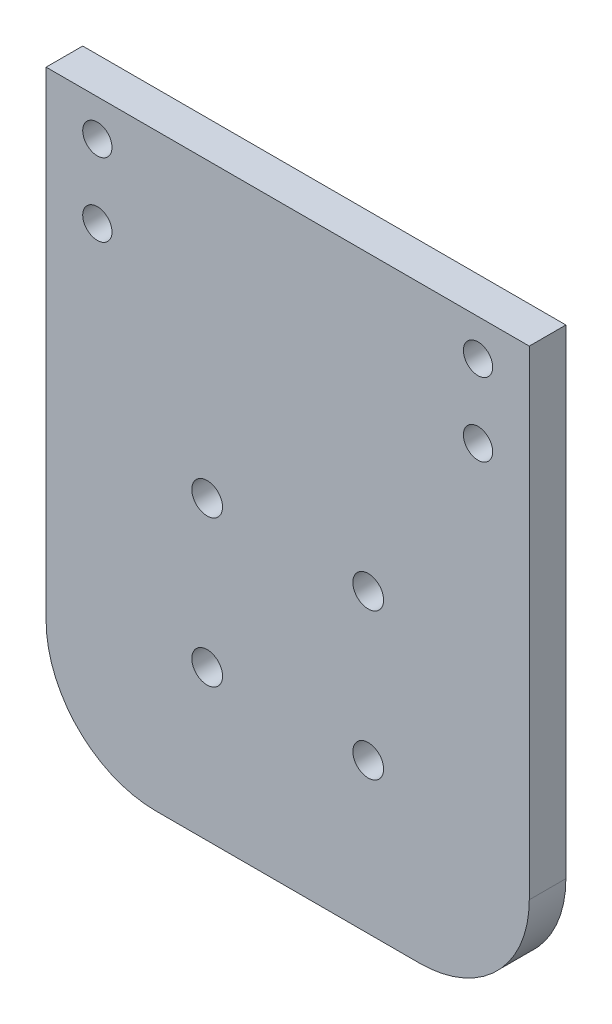
ISO-10303-21;
HEADER;
FILE_DESCRIPTION(('STEP AP214'),'2;1');
FILE_NAME('part.step','',(''),(''),'','','');
FILE_SCHEMA(('AUTOMOTIVE_DESIGN { 1 0 10303 214 1 1 1 1 }'));
ENDSEC;
DATA;
#1=APPLICATION_CONTEXT('core data for automotive mechanical design processes');
#2=APPLICATION_PROTOCOL_DEFINITION('international standard','automotive_design',2000,#1);
#3=PRODUCT_CONTEXT('',#1,'mechanical');
#4=PRODUCT('Part','Part','',(#3));
#5=PRODUCT_RELATED_PRODUCT_CATEGORY('part','',(#4));
#6=PRODUCT_DEFINITION_FORMATION('','',#4);
#7=PRODUCT_DEFINITION_CONTEXT('part definition',#1,'design');
#8=PRODUCT_DEFINITION('design','',#6,#7);
#9=PRODUCT_DEFINITION_SHAPE('','',#8);
#10=(LENGTH_UNIT() NAMED_UNIT(*) SI_UNIT(.MILLI.,.METRE.));
#11=(NAMED_UNIT(*) PLANE_ANGLE_UNIT() SI_UNIT($,.RADIAN.));
#12=(NAMED_UNIT(*) SI_UNIT($,.STERADIAN.) SOLID_ANGLE_UNIT());
#13=UNCERTAINTY_MEASURE_WITH_UNIT(LENGTH_MEASURE(1.E-05),#10,'distance_accuracy_value','');
#14=(GEOMETRIC_REPRESENTATION_CONTEXT(3) GLOBAL_UNCERTAINTY_ASSIGNED_CONTEXT((#13)) GLOBAL_UNIT_ASSIGNED_CONTEXT((#10,
#11,#12)) REPRESENTATION_CONTEXT('',''));
#15=CARTESIAN_POINT('',(0.,0.,0.));
#16=DIRECTION('',(0.,0.,1.));
#17=DIRECTION('',(1.,0.,0.));
#18=AXIS2_PLACEMENT_3D('',#15,#16,#17);
#19=CARTESIAN_POINT('',(-33.,-40.25,5.));
#20=DIRECTION('',(1.,0.,0.));
#21=DIRECTION('',(0.,1.,0.));
#22=AXIS2_PLACEMENT_3D('',#19,#20,#21);
#23=PLANE('',#22);
#24=DIRECTION('',(0.,-1.,0.));
#25=VECTOR('',#24,1.);
#26=CARTESIAN_POINT('',(-33.,-40.25,0.));
#27=LINE('',#26,#25);
#28=CARTESIAN_POINT('',(-33.,40.25,0.));
#29=VERTEX_POINT('',#28);
#30=CARTESIAN_POINT('',(-33.,-25.25,0.));
#31=VERTEX_POINT('',#30);
#32=EDGE_CURVE('E123',#29,#31,#27,.T.);
#33=ORIENTED_EDGE('',*,*,#32,.T.);
#34=DIRECTION('',(0.,0.,-1.));
#35=VECTOR('',#34,1.);
#36=CARTESIAN_POINT('',(-33.,-25.25,5.));
#37=LINE('',#36,#35);
#38=CARTESIAN_POINT('',(-33.,-25.25,5.));
#39=VERTEX_POINT('',#38);
#40=EDGE_CURVE('E63',#31,#39,#37,.F.);
#41=ORIENTED_EDGE('',*,*,#40,.T.);
#42=DIRECTION('',(0.,-1.,0.));
#43=VECTOR('',#42,1.);
#44=CARTESIAN_POINT('',(-33.,-40.25,5.));
#45=LINE('',#44,#43);
#46=CARTESIAN_POINT('',(-33.,40.25,5.));
#47=VERTEX_POINT('',#46);
#48=EDGE_CURVE('E135',#47,#39,#45,.T.);
#49=ORIENTED_EDGE('',*,*,#48,.F.);
#50=DIRECTION('',(0.,0.,-1.));
#51=VECTOR('',#50,1.);
#52=CARTESIAN_POINT('',(-33.,40.25,5.));
#53=LINE('',#52,#51);
#54=EDGE_CURVE('E113',#47,#29,#53,.T.);
#55=ORIENTED_EDGE('',*,*,#54,.T.);
#56=EDGE_LOOP('',(#33,#41,#49,#55));
#57=FACE_BOUND('',#56,.T.);
#58=ADVANCED_FACE('F39',(#57),#23,.F.);
#59=CARTESIAN_POINT('',(33.,-40.25,5.));
#60=DIRECTION('',(0.,1.,0.));
#61=DIRECTION('',(-1.,0.,0.));
#62=AXIS2_PLACEMENT_3D('',#59,#60,#61);
#63=PLANE('',#62);
#64=DIRECTION('',(1.,0.,0.));
#65=VECTOR('',#64,1.);
#66=CARTESIAN_POINT('',(33.,-40.25,5.));
#67=LINE('',#66,#65);
#68=CARTESIAN_POINT('',(-18.,-40.25,5.));
#69=VERTEX_POINT('',#68);
#70=CARTESIAN_POINT('',(18.,-40.25,5.));
#71=VERTEX_POINT('',#70);
#72=EDGE_CURVE('E102',#69,#71,#67,.T.);
#73=ORIENTED_EDGE('',*,*,#72,.F.);
#74=DIRECTION('',(0.,0.,-1.));
#75=VECTOR('',#74,1.);
#76=CARTESIAN_POINT('',(-18.,-40.25,5.));
#77=LINE('',#76,#75);
#78=CARTESIAN_POINT('',(-18.,-40.25,0.));
#79=VERTEX_POINT('',#78);
#80=EDGE_CURVE('E158',#69,#79,#77,.T.);
#81=ORIENTED_EDGE('',*,*,#80,.T.);
#82=DIRECTION('',(1.,0.,0.));
#83=VECTOR('',#82,1.);
#84=CARTESIAN_POINT('',(33.,-40.25,0.));
#85=LINE('',#84,#83);
#86=CARTESIAN_POINT('',(18.,-40.25,0.));
#87=VERTEX_POINT('',#86);
#88=EDGE_CURVE('E126',#79,#87,#85,.T.);
#89=ORIENTED_EDGE('',*,*,#88,.T.);
#90=DIRECTION('',(0.,0.,-1.));
#91=VECTOR('',#90,1.);
#92=CARTESIAN_POINT('',(18.,-40.25,5.));
#93=LINE('',#92,#91);
#94=EDGE_CURVE('E112',#87,#71,#93,.F.);
#95=ORIENTED_EDGE('',*,*,#94,.T.);
#96=EDGE_LOOP('',(#73,#81,#89,#95));
#97=FACE_BOUND('',#96,.T.);
#98=ADVANCED_FACE('F177',(#97),#63,.F.);
#99=CARTESIAN_POINT('',(33.,-40.25,5.));
#100=DIRECTION('',(-1.,0.,0.));
#101=DIRECTION('',(0.,0.,1.));
#102=AXIS2_PLACEMENT_3D('',#99,#100,#101);
#103=PLANE('',#102);
#104=DIRECTION('',(0.,1.,0.));
#105=VECTOR('',#104,1.);
#106=CARTESIAN_POINT('',(33.,-40.25,5.));
#107=LINE('',#106,#105);
#108=CARTESIAN_POINT('',(33.,-25.25,5.));
#109=VERTEX_POINT('',#108);
#110=CARTESIAN_POINT('',(33.,40.25,5.));
#111=VERTEX_POINT('',#110);
#112=EDGE_CURVE('E93',#109,#111,#107,.T.);
#113=ORIENTED_EDGE('',*,*,#112,.F.);
#114=DIRECTION('',(0.,0.,-1.));
#115=VECTOR('',#114,1.);
#116=CARTESIAN_POINT('',(33.,-25.25,5.));
#117=LINE('',#116,#115);
#118=CARTESIAN_POINT('',(33.,-25.25,0.));
#119=VERTEX_POINT('',#118);
#120=EDGE_CURVE('E11',#109,#119,#117,.T.);
#121=ORIENTED_EDGE('',*,*,#120,.T.);
#122=DIRECTION('',(0.,1.,0.));
#123=VECTOR('',#122,1.);
#124=CARTESIAN_POINT('',(33.,-40.25,0.));
#125=LINE('',#124,#123);
#126=CARTESIAN_POINT('',(33.,40.25,0.));
#127=VERTEX_POINT('',#126);
#128=EDGE_CURVE('E108',#119,#127,#125,.T.);
#129=ORIENTED_EDGE('',*,*,#128,.T.);
#130=DIRECTION('',(0.,0.,-1.));
#131=VECTOR('',#130,1.);
#132=CARTESIAN_POINT('',(33.,40.25,5.));
#133=LINE('',#132,#131);
#134=EDGE_CURVE('E105',#111,#127,#133,.T.);
#135=ORIENTED_EDGE('',*,*,#134,.F.);
#136=EDGE_LOOP('',(#113,#121,#129,#135));
#137=FACE_BOUND('',#136,.T.);
#138=ADVANCED_FACE('F106',(#137),#103,.F.);
#139=CARTESIAN_POINT('',(33.,40.25,5.));
#140=DIRECTION('',(0.,-1.,0.));
#141=DIRECTION('',(1.,0.,0.));
#142=AXIS2_PLACEMENT_3D('',#139,#140,#141);
#143=PLANE('',#142);
#144=DIRECTION('',(-1.,0.,0.));
#145=VECTOR('',#144,1.);
#146=CARTESIAN_POINT('',(33.,40.25,0.));
#147=LINE('',#146,#145);
#148=EDGE_CURVE('E133',#127,#29,#147,.T.);
#149=ORIENTED_EDGE('',*,*,#148,.T.);
#150=ORIENTED_EDGE('',*,*,#54,.F.);
#151=DIRECTION('',(-1.,0.,0.));
#152=VECTOR('',#151,1.);
#153=CARTESIAN_POINT('',(33.,40.25,5.));
#154=LINE('',#153,#152);
#155=EDGE_CURVE('E97',#111,#47,#154,.T.);
#156=ORIENTED_EDGE('',*,*,#155,.F.);
#157=ORIENTED_EDGE('',*,*,#134,.T.);
#158=EDGE_LOOP('',(#149,#150,#156,#157));
#159=FACE_BOUND('',#158,.T.);
#160=ADVANCED_FACE('F115',(#159),#143,.F.);
#161=CARTESIAN_POINT('',(0.,0.,5.));
#162=DIRECTION('',(0.,0.,1.));
#163=DIRECTION('',(1.,0.,0.));
#164=AXIS2_PLACEMENT_3D('',#161,#162,#163);
#165=PLANE('',#164);
#166=CARTESIAN_POINT('',(11.,0.250000000000007,5.));
#167=DIRECTION('',(0.,0.,1.));
#168=DIRECTION('',(1.,0.,0.));
#169=AXIS2_PLACEMENT_3D('',#166,#167,#168);
#170=CIRCLE('',#169,2.1);
#171=CARTESIAN_POINT('',(13.1,0.250000000000007,5.));
#172=VERTEX_POINT('',#171);
#173=EDGE_CURVE('E148',#172,#172,#170,.T.);
#174=ORIENTED_EDGE('',*,*,#173,.F.);
#175=EDGE_LOOP('',(#174));
#176=FACE_BOUND('',#175,.T.);
#177=CARTESIAN_POINT('',(11.,-19.75,5.));
#178=DIRECTION('',(0.,0.,1.));
#179=DIRECTION('',(1.,0.,0.));
#180=AXIS2_PLACEMENT_3D('',#177,#178,#179);
#181=CIRCLE('',#180,2.1);
#182=CARTESIAN_POINT('',(13.1,-19.75,5.));
#183=VERTEX_POINT('',#182);
#184=EDGE_CURVE('E225',#183,#183,#181,.T.);
#185=ORIENTED_EDGE('',*,*,#184,.F.);
#186=EDGE_LOOP('',(#185));
#187=FACE_BOUND('',#186,.T.);
#188=CARTESIAN_POINT('',(-11.,-19.75,5.));
#189=DIRECTION('',(0.,0.,1.));
#190=DIRECTION('',(1.,0.,0.));
#191=AXIS2_PLACEMENT_3D('',#188,#189,#190);
#192=CIRCLE('',#191,2.1);
#193=CARTESIAN_POINT('',(-8.89999999999999,-19.75,5.));
#194=VERTEX_POINT('',#193);
#195=EDGE_CURVE('E221',#194,#194,#192,.T.);
#196=ORIENTED_EDGE('',*,*,#195,.F.);
#197=EDGE_LOOP('',(#196));
#198=FACE_BOUND('',#197,.T.);
#199=CARTESIAN_POINT('',(-11.,0.250000000000007,5.));
#200=DIRECTION('',(0.,0.,1.));
#201=DIRECTION('',(1.,0.,0.));
#202=AXIS2_PLACEMENT_3D('',#199,#200,#201);
#203=CIRCLE('',#202,2.1);
#204=CARTESIAN_POINT('',(-8.9,0.250000000000007,5.));
#205=VERTEX_POINT('',#204);
#206=EDGE_CURVE('E142',#205,#205,#203,.T.);
#207=ORIENTED_EDGE('',*,*,#206,.F.);
#208=EDGE_LOOP('',(#207));
#209=FACE_BOUND('',#208,.T.);
#210=CARTESIAN_POINT('',(26.,35.25,5.));
#211=DIRECTION('',(0.,0.,1.));
#212=DIRECTION('',(1.,0.,0.));
#213=AXIS2_PLACEMENT_3D('',#210,#211,#212);
#214=CIRCLE('',#213,2.);
#215=CARTESIAN_POINT('',(28.,35.25,5.));
#216=VERTEX_POINT('',#215);
#217=EDGE_CURVE('E211',#216,#216,#214,.T.);
#218=ORIENTED_EDGE('',*,*,#217,.F.);
#219=EDGE_LOOP('',(#218));
#220=FACE_BOUND('',#219,.T.);
#221=CARTESIAN_POINT('',(26.,25.25,5.));
#222=DIRECTION('',(0.,0.,1.));
#223=DIRECTION('',(1.,0.,0.));
#224=AXIS2_PLACEMENT_3D('',#221,#222,#223);
#225=CIRCLE('',#224,2.);
#226=CARTESIAN_POINT('',(28.,25.25,5.));
#227=VERTEX_POINT('',#226);
#228=EDGE_CURVE('E203',#227,#227,#225,.T.);
#229=ORIENTED_EDGE('',*,*,#228,.F.);
#230=EDGE_LOOP('',(#229));
#231=FACE_BOUND('',#230,.T.);
#232=CARTESIAN_POINT('',(-26.,25.25,5.));
#233=DIRECTION('',(0.,0.,1.));
#234=DIRECTION('',(1.,0.,0.));
#235=AXIS2_PLACEMENT_3D('',#232,#233,#234);
#236=CIRCLE('',#235,2.00000000000001);
#237=CARTESIAN_POINT('',(-24.,25.25,5.));
#238=VERTEX_POINT('',#237);
#239=EDGE_CURVE('E141',#238,#238,#236,.T.);
#240=ORIENTED_EDGE('',*,*,#239,.F.);
#241=EDGE_LOOP('',(#240));
#242=FACE_BOUND('',#241,.T.);
#243=CARTESIAN_POINT('',(-26.,35.25,5.));
#244=DIRECTION('',(0.,0.,1.));
#245=DIRECTION('',(1.,0.,0.));
#246=AXIS2_PLACEMENT_3D('',#243,#244,#245);
#247=CIRCLE('',#246,2.);
#248=CARTESIAN_POINT('',(-24.,35.25,5.));
#249=VERTEX_POINT('',#248);
#250=EDGE_CURVE('E188',#249,#249,#247,.T.);
#251=ORIENTED_EDGE('',*,*,#250,.F.);
#252=EDGE_LOOP('',(#251));
#253=FACE_BOUND('',#252,.T.);
#254=ORIENTED_EDGE('',*,*,#48,.T.);
#255=CARTESIAN_POINT('',(-18.,-25.25,5.));
#256=DIRECTION('',(0.,0.,1.));
#257=DIRECTION('',(1.,0.,0.));
#258=AXIS2_PLACEMENT_3D('',#255,#256,#257);
#259=CIRCLE('',#258,15.);
#260=EDGE_CURVE('E48',#39,#69,#259,.T.);
#261=ORIENTED_EDGE('',*,*,#260,.T.);
#262=ORIENTED_EDGE('',*,*,#72,.T.);
#263=CARTESIAN_POINT('',(18.,-25.25,5.));
#264=DIRECTION('',(0.,0.,1.));
#265=DIRECTION('',(1.,0.,0.));
#266=AXIS2_PLACEMENT_3D('',#263,#264,#265);
#267=CIRCLE('',#266,15.);
#268=EDGE_CURVE('E55',#71,#109,#267,.T.);
#269=ORIENTED_EDGE('',*,*,#268,.T.);
#270=ORIENTED_EDGE('',*,*,#112,.T.);
#271=ORIENTED_EDGE('',*,*,#155,.T.);
#272=EDGE_LOOP('',(#254,#261,#262,#269,#270,#271));
#273=FACE_BOUND('',#272,.T.);
#274=ADVANCED_FACE('F95',(#176,#187,#198,#209,#220,#231,#242,#253,#273),#165,.T.);
#275=CARTESIAN_POINT('',(0.,0.,0.));
#276=DIRECTION('',(0.,0.,1.));
#277=DIRECTION('',(1.,0.,0.));
#278=AXIS2_PLACEMENT_3D('',#275,#276,#277);
#279=PLANE('',#278);
#280=CARTESIAN_POINT('',(11.,0.250000000000007,0.));
#281=DIRECTION('',(0.,0.,1.));
#282=DIRECTION('',(1.,0.,0.));
#283=AXIS2_PLACEMENT_3D('',#280,#281,#282);
#284=CIRCLE('',#283,2.1);
#285=CARTESIAN_POINT('',(13.1,0.250000000000007,0.));
#286=VERTEX_POINT('',#285);
#287=EDGE_CURVE('E152',#286,#286,#284,.T.);
#288=ORIENTED_EDGE('',*,*,#287,.T.);
#289=EDGE_LOOP('',(#288));
#290=FACE_BOUND('',#289,.T.);
#291=CARTESIAN_POINT('',(11.,-19.75,0.));
#292=DIRECTION('',(0.,0.,1.));
#293=DIRECTION('',(1.,0.,0.));
#294=AXIS2_PLACEMENT_3D('',#291,#292,#293);
#295=CIRCLE('',#294,2.1);
#296=CARTESIAN_POINT('',(13.1,-19.75,0.));
#297=VERTEX_POINT('',#296);
#298=EDGE_CURVE('E147',#297,#297,#295,.T.);
#299=ORIENTED_EDGE('',*,*,#298,.T.);
#300=EDGE_LOOP('',(#299));
#301=FACE_BOUND('',#300,.T.);
#302=CARTESIAN_POINT('',(-11.,-19.75,0.));
#303=DIRECTION('',(0.,0.,1.));
#304=DIRECTION('',(1.,0.,0.));
#305=AXIS2_PLACEMENT_3D('',#302,#303,#304);
#306=CIRCLE('',#305,2.1);
#307=CARTESIAN_POINT('',(-8.89999999999999,-19.75,0.));
#308=VERTEX_POINT('',#307);
#309=EDGE_CURVE('E143',#308,#308,#306,.T.);
#310=ORIENTED_EDGE('',*,*,#309,.T.);
#311=EDGE_LOOP('',(#310));
#312=FACE_BOUND('',#311,.T.);
#313=CARTESIAN_POINT('',(-11.,0.250000000000007,0.));
#314=DIRECTION('',(0.,0.,1.));
#315=DIRECTION('',(1.,0.,0.));
#316=AXIS2_PLACEMENT_3D('',#313,#314,#315);
#317=CIRCLE('',#316,2.1);
#318=CARTESIAN_POINT('',(-8.9,0.250000000000007,0.));
#319=VERTEX_POINT('',#318);
#320=EDGE_CURVE('E137',#319,#319,#317,.T.);
#321=ORIENTED_EDGE('',*,*,#320,.T.);
#322=EDGE_LOOP('',(#321));
#323=FACE_BOUND('',#322,.T.);
#324=CARTESIAN_POINT('',(26.,35.25,0.));
#325=DIRECTION('',(0.,0.,1.));
#326=DIRECTION('',(1.,0.,0.));
#327=AXIS2_PLACEMENT_3D('',#324,#325,#326);
#328=CIRCLE('',#327,2.);
#329=CARTESIAN_POINT('',(28.,35.25,0.));
#330=VERTEX_POINT('',#329);
#331=EDGE_CURVE('E192',#330,#330,#328,.T.);
#332=ORIENTED_EDGE('',*,*,#331,.T.);
#333=EDGE_LOOP('',(#332));
#334=FACE_BOUND('',#333,.T.);
#335=CARTESIAN_POINT('',(26.,25.25,0.));
#336=DIRECTION('',(0.,0.,1.));
#337=DIRECTION('',(1.,0.,0.));
#338=AXIS2_PLACEMENT_3D('',#335,#336,#337);
#339=CIRCLE('',#338,2.);
#340=CARTESIAN_POINT('',(28.,25.25,0.));
#341=VERTEX_POINT('',#340);
#342=EDGE_CURVE('E207',#341,#341,#339,.T.);
#343=ORIENTED_EDGE('',*,*,#342,.T.);
#344=EDGE_LOOP('',(#343));
#345=FACE_BOUND('',#344,.T.);
#346=CARTESIAN_POINT('',(-26.,25.25,0.));
#347=DIRECTION('',(0.,0.,1.));
#348=DIRECTION('',(1.,0.,0.));
#349=AXIS2_PLACEMENT_3D('',#346,#347,#348);
#350=CIRCLE('',#349,2.00000000000001);
#351=CARTESIAN_POINT('',(-24.,25.25,0.));
#352=VERTEX_POINT('',#351);
#353=EDGE_CURVE('E199',#352,#352,#350,.T.);
#354=ORIENTED_EDGE('',*,*,#353,.T.);
#355=EDGE_LOOP('',(#354));
#356=FACE_BOUND('',#355,.T.);
#357=CARTESIAN_POINT('',(-26.,35.25,0.));
#358=DIRECTION('',(0.,0.,1.));
#359=DIRECTION('',(1.,0.,0.));
#360=AXIS2_PLACEMENT_3D('',#357,#358,#359);
#361=CIRCLE('',#360,2.);
#362=CARTESIAN_POINT('',(-24.,35.25,0.));
#363=VERTEX_POINT('',#362);
#364=EDGE_CURVE('E127',#363,#363,#361,.T.);
#365=ORIENTED_EDGE('',*,*,#364,.T.);
#366=EDGE_LOOP('',(#365));
#367=FACE_BOUND('',#366,.T.);
#368=ORIENTED_EDGE('',*,*,#88,.F.);
#369=CARTESIAN_POINT('',(-18.,-25.25,0.));
#370=DIRECTION('',(0.,0.,1.));
#371=DIRECTION('',(1.,0.,0.));
#372=AXIS2_PLACEMENT_3D('',#369,#370,#371);
#373=CIRCLE('',#372,15.);
#374=EDGE_CURVE('E165',#79,#31,#373,.F.);
#375=ORIENTED_EDGE('',*,*,#374,.T.);
#376=ORIENTED_EDGE('',*,*,#32,.F.);
#377=ORIENTED_EDGE('',*,*,#148,.F.);
#378=ORIENTED_EDGE('',*,*,#128,.F.);
#379=CARTESIAN_POINT('',(18.,-25.25,0.));
#380=DIRECTION('',(0.,0.,1.));
#381=DIRECTION('',(1.,0.,0.));
#382=AXIS2_PLACEMENT_3D('',#379,#380,#381);
#383=CIRCLE('',#382,15.);
#384=EDGE_CURVE('E162',#119,#87,#383,.F.);
#385=ORIENTED_EDGE('',*,*,#384,.T.);
#386=EDGE_LOOP('',(#368,#375,#376,#377,#378,#385));
#387=FACE_BOUND('',#386,.T.);
#388=ADVANCED_FACE('F184',(#290,#301,#312,#323,#334,#345,#356,#367,#387),#279,.F.);
#389=CARTESIAN_POINT('',(-26.,35.25,0.));
#390=DIRECTION('',(0.,0.,1.));
#391=DIRECTION('',(1.,0.,0.));
#392=AXIS2_PLACEMENT_3D('',#389,#390,#391);
#393=CYLINDRICAL_SURFACE('',#392,2.);
#394=ORIENTED_EDGE('',*,*,#364,.F.);
#395=EDGE_LOOP('',(#394));
#396=FACE_BOUND('',#395,.T.);
#397=ORIENTED_EDGE('',*,*,#250,.T.);
#398=EDGE_LOOP('',(#397));
#399=FACE_BOUND('',#398,.T.);
#400=ADVANCED_FACE('F253',(#396,#399),#393,.F.);
#401=CARTESIAN_POINT('',(-26.,25.25,0.));
#402=DIRECTION('',(0.,0.,1.));
#403=DIRECTION('',(1.,0.,0.));
#404=AXIS2_PLACEMENT_3D('',#401,#402,#403);
#405=CYLINDRICAL_SURFACE('',#404,2.00000000000001);
#406=ORIENTED_EDGE('',*,*,#353,.F.);
#407=EDGE_LOOP('',(#406));
#408=FACE_BOUND('',#407,.T.);
#409=ORIENTED_EDGE('',*,*,#239,.T.);
#410=EDGE_LOOP('',(#409));
#411=FACE_BOUND('',#410,.T.);
#412=ADVANCED_FACE('F255',(#408,#411),#405,.F.);
#413=CARTESIAN_POINT('',(26.,25.25,0.));
#414=DIRECTION('',(0.,0.,1.));
#415=DIRECTION('',(1.,0.,0.));
#416=AXIS2_PLACEMENT_3D('',#413,#414,#415);
#417=CYLINDRICAL_SURFACE('',#416,2.);
#418=ORIENTED_EDGE('',*,*,#342,.F.);
#419=EDGE_LOOP('',(#418));
#420=FACE_BOUND('',#419,.T.);
#421=ORIENTED_EDGE('',*,*,#228,.T.);
#422=EDGE_LOOP('',(#421));
#423=FACE_BOUND('',#422,.T.);
#424=ADVANCED_FACE('F262',(#420,#423),#417,.F.);
#425=CARTESIAN_POINT('',(26.,35.25,0.));
#426=DIRECTION('',(0.,0.,1.));
#427=DIRECTION('',(1.,0.,0.));
#428=AXIS2_PLACEMENT_3D('',#425,#426,#427);
#429=CYLINDRICAL_SURFACE('',#428,2.);
#430=ORIENTED_EDGE('',*,*,#331,.F.);
#431=EDGE_LOOP('',(#430));
#432=FACE_BOUND('',#431,.T.);
#433=ORIENTED_EDGE('',*,*,#217,.T.);
#434=EDGE_LOOP('',(#433));
#435=FACE_BOUND('',#434,.T.);
#436=ADVANCED_FACE('F296',(#432,#435),#429,.F.);
#437=CARTESIAN_POINT('',(-11.,0.250000000000007,-5.));
#438=DIRECTION('',(0.,0.,1.));
#439=DIRECTION('',(1.,0.,0.));
#440=AXIS2_PLACEMENT_3D('',#437,#438,#439);
#441=CYLINDRICAL_SURFACE('',#440,2.1);
#442=ORIENTED_EDGE('',*,*,#206,.T.);
#443=EDGE_LOOP('',(#442));
#444=FACE_BOUND('',#443,.T.);
#445=ORIENTED_EDGE('',*,*,#320,.F.);
#446=EDGE_LOOP('',(#445));
#447=FACE_BOUND('',#446,.T.);
#448=ADVANCED_FACE('F292',(#444,#447),#441,.F.);
#449=CARTESIAN_POINT('',(-11.,-19.75,-5.));
#450=DIRECTION('',(0.,0.,1.));
#451=DIRECTION('',(1.,0.,0.));
#452=AXIS2_PLACEMENT_3D('',#449,#450,#451);
#453=CYLINDRICAL_SURFACE('',#452,2.1);
#454=ORIENTED_EDGE('',*,*,#195,.T.);
#455=EDGE_LOOP('',(#454));
#456=FACE_BOUND('',#455,.T.);
#457=ORIENTED_EDGE('',*,*,#309,.F.);
#458=EDGE_LOOP('',(#457));
#459=FACE_BOUND('',#458,.T.);
#460=ADVANCED_FACE('F286',(#456,#459),#453,.F.);
#461=CARTESIAN_POINT('',(11.,-19.75,-5.));
#462=DIRECTION('',(0.,0.,1.));
#463=DIRECTION('',(1.,0.,0.));
#464=AXIS2_PLACEMENT_3D('',#461,#462,#463);
#465=CYLINDRICAL_SURFACE('',#464,2.1);
#466=ORIENTED_EDGE('',*,*,#184,.T.);
#467=EDGE_LOOP('',(#466));
#468=FACE_BOUND('',#467,.T.);
#469=ORIENTED_EDGE('',*,*,#298,.F.);
#470=EDGE_LOOP('',(#469));
#471=FACE_BOUND('',#470,.T.);
#472=ADVANCED_FACE('F281',(#468,#471),#465,.F.);
#473=CARTESIAN_POINT('',(11.,0.250000000000007,-5.));
#474=DIRECTION('',(0.,0.,1.));
#475=DIRECTION('',(1.,0.,0.));
#476=AXIS2_PLACEMENT_3D('',#473,#474,#475);
#477=CYLINDRICAL_SURFACE('',#476,2.1);
#478=ORIENTED_EDGE('',*,*,#173,.T.);
#479=EDGE_LOOP('',(#478));
#480=FACE_BOUND('',#479,.T.);
#481=ORIENTED_EDGE('',*,*,#287,.F.);
#482=EDGE_LOOP('',(#481));
#483=FACE_BOUND('',#482,.T.);
#484=ADVANCED_FACE('F233',(#480,#483),#477,.F.);
#485=CARTESIAN_POINT('',(-18.,-25.25,5.));
#486=DIRECTION('',(0.,0.,-1.));
#487=DIRECTION('',(-1.,0.,0.));
#488=AXIS2_PLACEMENT_3D('',#485,#486,#487);
#489=CYLINDRICAL_SURFACE('',#488,15.);
#490=ORIENTED_EDGE('',*,*,#260,.F.);
#491=ORIENTED_EDGE('',*,*,#40,.F.);
#492=ORIENTED_EDGE('',*,*,#374,.F.);
#493=ORIENTED_EDGE('',*,*,#80,.F.);
#494=EDGE_LOOP('',(#490,#491,#492,#493));
#495=FACE_BOUND('',#494,.T.);
#496=ADVANCED_FACE('F181',(#495),#489,.T.);
#497=CARTESIAN_POINT('',(18.,-25.25,5.));
#498=DIRECTION('',(0.,0.,-1.));
#499=DIRECTION('',(-1.,0.,0.));
#500=AXIS2_PLACEMENT_3D('',#497,#498,#499);
#501=CYLINDRICAL_SURFACE('',#500,15.);
#502=ORIENTED_EDGE('',*,*,#268,.F.);
#503=ORIENTED_EDGE('',*,*,#94,.F.);
#504=ORIENTED_EDGE('',*,*,#384,.F.);
#505=ORIENTED_EDGE('',*,*,#120,.F.);
#506=EDGE_LOOP('',(#502,#503,#504,#505));
#507=FACE_BOUND('',#506,.T.);
#508=ADVANCED_FACE('F41',(#507),#501,.T.);
#509=CLOSED_SHELL('',(#58,#98,#138,#160,#274,#388,#400,#412,#424,#436,#448,#460,#472,#484,#496,#508));
#510=MANIFOLD_SOLID_BREP('B2',#509);
#511=ADVANCED_BREP_SHAPE_REPRESENTATION('',(#18,#510),#14);
#512=SHAPE_DEFINITION_REPRESENTATION(#9,#511);
ENDSEC;
END-ISO-10303-21;
